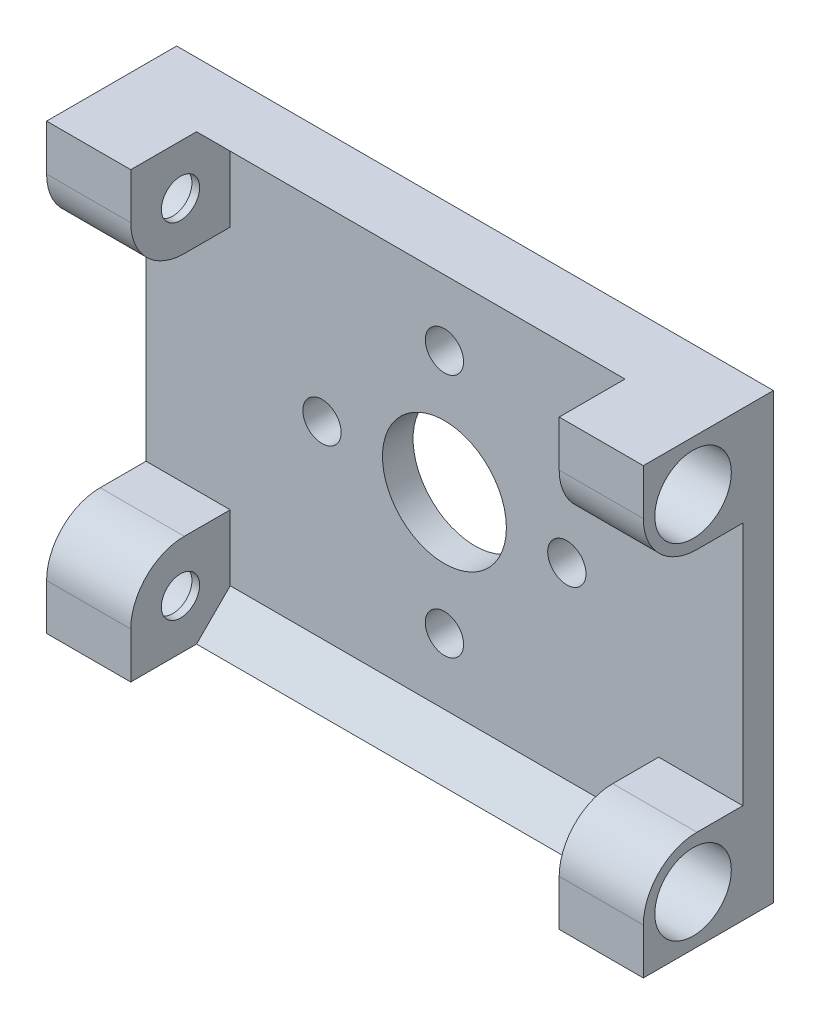
ISO-10303-21;
HEADER;
FILE_DESCRIPTION(('STEP AP214'),'2;1');
FILE_NAME('part.step','',(''),(''),'','','');
FILE_SCHEMA(('AUTOMOTIVE_DESIGN { 1 0 10303 214 1 1 1 1 }'));
ENDSEC;
DATA;
#1=APPLICATION_CONTEXT('core data for automotive mechanical design processes');
#2=APPLICATION_PROTOCOL_DEFINITION('international standard','automotive_design',2000,#1);
#3=PRODUCT_CONTEXT('',#1,'mechanical');
#4=PRODUCT('Part','Part','',(#3));
#5=PRODUCT_RELATED_PRODUCT_CATEGORY('part','',(#4));
#6=PRODUCT_DEFINITION_FORMATION('','',#4);
#7=PRODUCT_DEFINITION_CONTEXT('part definition',#1,'design');
#8=PRODUCT_DEFINITION('design','',#6,#7);
#9=PRODUCT_DEFINITION_SHAPE('','',#8);
#10=(LENGTH_UNIT() NAMED_UNIT(*) SI_UNIT(.MILLI.,.METRE.));
#11=(NAMED_UNIT(*) PLANE_ANGLE_UNIT() SI_UNIT($,.RADIAN.));
#12=(NAMED_UNIT(*) SI_UNIT($,.STERADIAN.) SOLID_ANGLE_UNIT());
#13=UNCERTAINTY_MEASURE_WITH_UNIT(LENGTH_MEASURE(1.E-05),#10,'distance_accuracy_value','');
#14=(GEOMETRIC_REPRESENTATION_CONTEXT(3) GLOBAL_UNCERTAINTY_ASSIGNED_CONTEXT((#13)) GLOBAL_UNIT_ASSIGNED_CONTEXT((#10,
#11,#12)) REPRESENTATION_CONTEXT('',''));
#15=CARTESIAN_POINT('',(0.,0.,0.));
#16=DIRECTION('',(0.,0.,1.));
#17=DIRECTION('',(1.,0.,0.));
#18=AXIS2_PLACEMENT_3D('',#15,#16,#17);
#19=CARTESIAN_POINT('',(-3.29953272048376,0.249999999999896,5.2500000000001));
#20=DIRECTION('',(-1.,0.,0.));
#21=DIRECTION('',(0.,0.,1.));
#22=AXIS2_PLACEMENT_3D('',#19,#20,#21);
#23=CYLINDRICAL_SURFACE('',#22,1.25);
#24=CARTESIAN_POINT('',(-14.0000000000002,0.249999999999896,5.2500000000001));
#25=DIRECTION('',(-1.,0.,0.));
#26=DIRECTION('',(0.,0.,1.));
#27=AXIS2_PLACEMENT_3D('',#24,#25,#26);
#28=CIRCLE('',#27,1.25);
#29=CARTESIAN_POINT('',(-14.0000000000002,0.249999999999896,6.5000000000001));
#30=VERTEX_POINT('',#29);
#31=EDGE_CURVE('E395',#30,#30,#28,.F.);
#32=ORIENTED_EDGE('',*,*,#31,.T.);
#33=EDGE_LOOP('',(#32));
#34=FACE_BOUND('',#33,.T.);
#35=CARTESIAN_POINT('',(-14.5,0.249999999999896,5.2500000000001));
#36=DIRECTION('',(-1.,0.,0.));
#37=DIRECTION('',(0.,0.,1.));
#38=AXIS2_PLACEMENT_3D('',#35,#36,#37);
#39=CIRCLE('',#38,1.25);
#40=CARTESIAN_POINT('',(-14.5,0.249999999999896,6.5000000000001));
#41=VERTEX_POINT('',#40);
#42=EDGE_CURVE('E111',#41,#41,#39,.F.);
#43=ORIENTED_EDGE('',*,*,#42,.F.);
#44=EDGE_LOOP('',(#43));
#45=FACE_BOUND('',#44,.T.);
#46=ADVANCED_FACE('F110',(#34,#45),#23,.F.);
#47=CARTESIAN_POINT('',(0.,0.,2.));
#48=DIRECTION('',(0.,0.,1.));
#49=DIRECTION('',(1.,0.,0.));
#50=AXIS2_PLACEMENT_3D('',#47,#48,#49);
#51=PLANE('',#50);
#52=DIRECTION('',(0.,-1.,0.));
#53=VECTOR('',#52,1.);
#54=CARTESIAN_POINT('',(13.9999999999998,0.,2.));
#55=LINE('',#54,#53);
#56=CARTESIAN_POINT('',(13.9999999999998,1.2999999999999,2.00000000000011));
#57=VERTEX_POINT('',#56);
#58=CARTESIAN_POINT('',(13.9999999999998,-3.0000000000001,2.));
#59=VERTEX_POINT('',#58);
#60=EDGE_CURVE('E257',#57,#59,#55,.T.);
#61=ORIENTED_EDGE('',*,*,#60,.F.);
#62=DIRECTION('',(1.,0.,0.));
#63=VECTOR('',#62,1.);
#64=CARTESIAN_POINT('',(-18.9627386254336,1.2999999999999,2.00000000000011));
#65=LINE('',#64,#63);
#66=CARTESIAN_POINT('',(-14.0000000000002,1.2999999999999,2.00000000000011));
#67=VERTEX_POINT('',#66);
#68=EDGE_CURVE('E264',#67,#57,#65,.T.);
#69=ORIENTED_EDGE('',*,*,#68,.F.);
#70=DIRECTION('',(0.,1.,0.));
#71=VECTOR('',#70,1.);
#72=CARTESIAN_POINT('',(-14.0000000000002,-3.0000000000001,2.));
#73=LINE('',#72,#71);
#74=CARTESIAN_POINT('',(-14.0000000000002,-3.0000000000001,2.));
#75=VERTEX_POINT('',#74);
#76=EDGE_CURVE('E121',#75,#67,#73,.T.);
#77=ORIENTED_EDGE('',*,*,#76,.F.);
#78=DIRECTION('',(-1.,0.,0.));
#79=VECTOR('',#78,1.);
#80=CARTESIAN_POINT('',(-3.29953272048376,-3.0000000000001,2.));
#81=LINE('',#80,#79);
#82=CARTESIAN_POINT('',(-19.5,-3.0000000000001,2.));
#83=VERTEX_POINT('',#82);
#84=EDGE_CURVE('E415',#75,#83,#81,.T.);
#85=ORIENTED_EDGE('',*,*,#84,.T.);
#86=DIRECTION('',(0.,-1.,0.));
#87=VECTOR('',#86,1.);
#88=CARTESIAN_POINT('',(-19.5,-22.8563709291264,2.));
#89=LINE('',#88,#87);
#90=CARTESIAN_POINT('',(-19.5,-18.9999999999999,2.));
#91=VERTEX_POINT('',#90);
#92=EDGE_CURVE('E116',#83,#91,#89,.T.);
#93=ORIENTED_EDGE('',*,*,#92,.T.);
#94=DIRECTION('',(-1.,0.,0.));
#95=VECTOR('',#94,1.);
#96=CARTESIAN_POINT('',(-3.29953272048376,-18.9999999999999,2.));
#97=LINE('',#96,#95);
#98=CARTESIAN_POINT('',(-14.0000000000002,-18.9999999999999,2.));
#99=VERTEX_POINT('',#98);
#100=EDGE_CURVE('E428',#99,#91,#97,.T.);
#101=ORIENTED_EDGE('',*,*,#100,.F.);
#102=DIRECTION('',(0.,1.,0.));
#103=VECTOR('',#102,1.);
#104=CARTESIAN_POINT('',(-14.0000000000002,-18.9999999999999,2.));
#105=LINE('',#104,#103);
#106=CARTESIAN_POINT('',(-14.0000000000002,-23.3000000000001,2.00000000000011));
#107=VERTEX_POINT('',#106);
#108=EDGE_CURVE('E135',#107,#99,#105,.T.);
#109=ORIENTED_EDGE('',*,*,#108,.F.);
#110=DIRECTION('',(1.,0.,0.));
#111=VECTOR('',#110,1.);
#112=CARTESIAN_POINT('',(-18.9627386254336,-23.3000000000001,2.00000000000011));
#113=LINE('',#112,#111);
#114=CARTESIAN_POINT('',(13.9999999999998,-23.3000000000001,2.00000000000011));
#115=VERTEX_POINT('',#114);
#116=EDGE_CURVE('E284',#107,#115,#113,.T.);
#117=ORIENTED_EDGE('',*,*,#116,.T.);
#118=CARTESIAN_POINT('',(13.9999999999998,-18.9999999999999,2.));
#119=VERTEX_POINT('',#118);
#120=EDGE_CURVE('E270',#119,#115,#55,.T.);
#121=ORIENTED_EDGE('',*,*,#120,.F.);
#122=DIRECTION('',(1.,0.,0.));
#123=VECTOR('',#122,1.);
#124=CARTESIAN_POINT('',(-16.2200264725232,-18.9999999999999,2.));
#125=LINE('',#124,#123);
#126=CARTESIAN_POINT('',(19.5,-18.9999999999999,2.));
#127=VERTEX_POINT('',#126);
#128=EDGE_CURVE('E348',#119,#127,#125,.T.);
#129=ORIENTED_EDGE('',*,*,#128,.T.);
#130=DIRECTION('',(0.,1.,0.));
#131=VECTOR('',#130,1.);
#132=CARTESIAN_POINT('',(19.5,-22.8563709291264,2.));
#133=LINE('',#132,#131);
#134=CARTESIAN_POINT('',(19.5,-3.0000000000001,2.));
#135=VERTEX_POINT('',#134);
#136=EDGE_CURVE('E12',#127,#135,#133,.T.);
#137=ORIENTED_EDGE('',*,*,#136,.T.);
#138=DIRECTION('',(1.,0.,0.));
#139=VECTOR('',#138,1.);
#140=CARTESIAN_POINT('',(-16.2200264725232,-3.0000000000001,2.));
#141=LINE('',#140,#139);
#142=EDGE_CURVE('E261',#59,#135,#141,.T.);
#143=ORIENTED_EDGE('',*,*,#142,.F.);
#144=EDGE_LOOP('',(#61,#69,#77,#85,#93,#101,#109,#117,#121,#129,#137,#143));
#145=FACE_BOUND('',#144,.T.);
#146=CARTESIAN_POINT('',(0.,-11.,2.));
#147=DIRECTION('',(0.,0.,1.));
#148=DIRECTION('',(1.,0.,0.));
#149=AXIS2_PLACEMENT_3D('',#146,#147,#148);
#150=CIRCLE('',#149,4.05);
#151=CARTESIAN_POINT('',(4.05,-11.,2.));
#152=VERTEX_POINT('',#151);
#153=EDGE_CURVE('E418',#152,#152,#150,.T.);
#154=ORIENTED_EDGE('',*,*,#153,.F.);
#155=EDGE_LOOP('',(#154));
#156=FACE_BOUND('',#155,.T.);
#157=CARTESIAN_POINT('',(0.,-3.,2.));
#158=DIRECTION('',(0.,0.,1.));
#159=DIRECTION('',(1.,0.,0.));
#160=AXIS2_PLACEMENT_3D('',#157,#158,#159);
#161=CIRCLE('',#160,1.25);
#162=CARTESIAN_POINT('',(1.25,-3.,2.));
#163=VERTEX_POINT('',#162);
#164=EDGE_CURVE('E464',#163,#163,#161,.T.);
#165=ORIENTED_EDGE('',*,*,#164,.F.);
#166=EDGE_LOOP('',(#165));
#167=FACE_BOUND('',#166,.T.);
#168=CARTESIAN_POINT('',(0.,-19.,2.));
#169=DIRECTION('',(0.,0.,1.));
#170=DIRECTION('',(1.,0.,0.));
#171=AXIS2_PLACEMENT_3D('',#168,#169,#170);
#172=CIRCLE('',#171,1.25);
#173=CARTESIAN_POINT('',(1.25,-19.,2.));
#174=VERTEX_POINT('',#173);
#175=EDGE_CURVE('E477',#174,#174,#172,.T.);
#176=ORIENTED_EDGE('',*,*,#175,.F.);
#177=EDGE_LOOP('',(#176));
#178=FACE_BOUND('',#177,.T.);
#179=CARTESIAN_POINT('',(-8.,-11.,2.));
#180=DIRECTION('',(0.,0.,1.));
#181=DIRECTION('',(1.,0.,0.));
#182=AXIS2_PLACEMENT_3D('',#179,#180,#181);
#183=CIRCLE('',#182,1.25);
#184=CARTESIAN_POINT('',(-6.75,-11.,2.));
#185=VERTEX_POINT('',#184);
#186=EDGE_CURVE('E468',#185,#185,#183,.T.);
#187=ORIENTED_EDGE('',*,*,#186,.F.);
#188=EDGE_LOOP('',(#187));
#189=FACE_BOUND('',#188,.T.);
#190=CARTESIAN_POINT('',(8.,-11.,2.));
#191=DIRECTION('',(0.,0.,1.));
#192=DIRECTION('',(1.,0.,0.));
#193=AXIS2_PLACEMENT_3D('',#190,#191,#192);
#194=CIRCLE('',#193,1.25);
#195=CARTESIAN_POINT('',(9.25,-11.,2.));
#196=VERTEX_POINT('',#195);
#197=EDGE_CURVE('E460',#196,#196,#194,.T.);
#198=ORIENTED_EDGE('',*,*,#197,.F.);
#199=EDGE_LOOP('',(#198));
#200=FACE_BOUND('',#199,.T.);
#201=ADVANCED_FACE('F259',(#145,#156,#167,#178,#189,#200),#51,.T.);
#202=CARTESIAN_POINT('',(0.,0.,0.));
#203=DIRECTION('',(0.,0.,1.));
#204=DIRECTION('',(1.,0.,0.));
#205=AXIS2_PLACEMENT_3D('',#202,#203,#204);
#206=PLANE('',#205);
#207=DIRECTION('',(-1.,0.,0.));
#208=VECTOR('',#207,1.);
#209=CARTESIAN_POINT('',(-3.29953272048376,3.4999999999999,0.));
#210=LINE('',#209,#208);
#211=CARTESIAN_POINT('',(19.5,3.4999999999999,0.));
#212=VERTEX_POINT('',#211);
#213=CARTESIAN_POINT('',(-19.5,3.4999999999999,0.));
#214=VERTEX_POINT('',#213);
#215=EDGE_CURVE('E406',#212,#214,#210,.T.);
#216=ORIENTED_EDGE('',*,*,#215,.F.);
#217=DIRECTION('',(0.,1.,0.));
#218=VECTOR('',#217,1.);
#219=CARTESIAN_POINT('',(19.5,-22.8563709291264,0.));
#220=LINE('',#219,#218);
#221=CARTESIAN_POINT('',(19.5,-25.4999999999999,0.));
#222=VERTEX_POINT('',#221);
#223=EDGE_CURVE('E485',#222,#212,#220,.T.);
#224=ORIENTED_EDGE('',*,*,#223,.F.);
#225=DIRECTION('',(-1.,0.,0.));
#226=VECTOR('',#225,1.);
#227=CARTESIAN_POINT('',(-3.29953272048376,-25.4999999999999,0.));
#228=LINE('',#227,#226);
#229=CARTESIAN_POINT('',(-19.5,-25.4999999999999,0.));
#230=VERTEX_POINT('',#229);
#231=EDGE_CURVE('E429',#222,#230,#228,.T.);
#232=ORIENTED_EDGE('',*,*,#231,.T.);
#233=DIRECTION('',(0.,-1.,0.));
#234=VECTOR('',#233,1.);
#235=CARTESIAN_POINT('',(-19.5,-22.8563709291264,0.));
#236=LINE('',#235,#234);
#237=EDGE_CURVE('E476',#214,#230,#236,.T.);
#238=ORIENTED_EDGE('',*,*,#237,.F.);
#239=EDGE_LOOP('',(#216,#224,#232,#238));
#240=FACE_BOUND('',#239,.T.);
#241=CARTESIAN_POINT('',(8.,-11.,0.));
#242=DIRECTION('',(0.,0.,1.));
#243=DIRECTION('',(1.,0.,0.));
#244=AXIS2_PLACEMENT_3D('',#241,#242,#243);
#245=CIRCLE('',#244,1.25);
#246=CARTESIAN_POINT('',(9.25,-11.,0.));
#247=VERTEX_POINT('',#246);
#248=EDGE_CURVE('E462',#247,#247,#245,.T.);
#249=ORIENTED_EDGE('',*,*,#248,.T.);
#250=EDGE_LOOP('',(#249));
#251=FACE_BOUND('',#250,.T.);
#252=CARTESIAN_POINT('',(0.,-3.,0.));
#253=DIRECTION('',(0.,0.,1.));
#254=DIRECTION('',(1.,0.,0.));
#255=AXIS2_PLACEMENT_3D('',#252,#253,#254);
#256=CIRCLE('',#255,1.25);
#257=CARTESIAN_POINT('',(1.25,-3.,0.));
#258=VERTEX_POINT('',#257);
#259=EDGE_CURVE('E458',#258,#258,#256,.T.);
#260=ORIENTED_EDGE('',*,*,#259,.T.);
#261=EDGE_LOOP('',(#260));
#262=FACE_BOUND('',#261,.T.);
#263=CARTESIAN_POINT('',(-8.,-11.,0.));
#264=DIRECTION('',(0.,0.,1.));
#265=DIRECTION('',(1.,0.,0.));
#266=AXIS2_PLACEMENT_3D('',#263,#264,#265);
#267=CIRCLE('',#266,1.25);
#268=CARTESIAN_POINT('',(-6.75,-11.,0.));
#269=VERTEX_POINT('',#268);
#270=EDGE_CURVE('E470',#269,#269,#267,.T.);
#271=ORIENTED_EDGE('',*,*,#270,.T.);
#272=EDGE_LOOP('',(#271));
#273=FACE_BOUND('',#272,.T.);
#274=CARTESIAN_POINT('',(0.,-19.,0.));
#275=DIRECTION('',(0.,0.,1.));
#276=DIRECTION('',(1.,0.,0.));
#277=AXIS2_PLACEMENT_3D('',#274,#275,#276);
#278=CIRCLE('',#277,1.25);
#279=CARTESIAN_POINT('',(1.25,-19.,0.));
#280=VERTEX_POINT('',#279);
#281=EDGE_CURVE('E472',#280,#280,#278,.T.);
#282=ORIENTED_EDGE('',*,*,#281,.T.);
#283=EDGE_LOOP('',(#282));
#284=FACE_BOUND('',#283,.T.);
#285=CARTESIAN_POINT('',(0.,-11.,0.));
#286=DIRECTION('',(0.,0.,1.));
#287=DIRECTION('',(1.,0.,0.));
#288=AXIS2_PLACEMENT_3D('',#285,#286,#287);
#289=CIRCLE('',#288,4.05);
#290=CARTESIAN_POINT('',(4.05,-11.,0.));
#291=VERTEX_POINT('',#290);
#292=EDGE_CURVE('E457',#291,#291,#289,.T.);
#293=ORIENTED_EDGE('',*,*,#292,.T.);
#294=EDGE_LOOP('',(#293));
#295=FACE_BOUND('',#294,.T.);
#296=ADVANCED_FACE('F502',(#240,#251,#262,#273,#284,#295),#206,.F.);
#297=CARTESIAN_POINT('',(-19.5,-22.8563709291264,2.));
#298=DIRECTION('',(1.,0.,0.));
#299=DIRECTION('',(0.,0.,-1.));
#300=AXIS2_PLACEMENT_3D('',#297,#298,#299);
#301=PLANE('',#300);
#302=CARTESIAN_POINT('',(-19.5,0.249999999999896,5.2500000000001));
#303=DIRECTION('',(-1.,0.,0.));
#304=DIRECTION('',(0.,0.,1.));
#305=AXIS2_PLACEMENT_3D('',#302,#303,#304);
#306=CIRCLE('',#305,2.5);
#307=CARTESIAN_POINT('',(-19.5,0.249999999999896,7.7500000000001));
#308=VERTEX_POINT('',#307);
#309=EDGE_CURVE('E373',#308,#308,#306,.T.);
#310=ORIENTED_EDGE('',*,*,#309,.F.);
#311=EDGE_LOOP('',(#310));
#312=FACE_BOUND('',#311,.T.);
#313=CARTESIAN_POINT('',(-19.5,-22.2500000000001,5.2500000000001));
#314=DIRECTION('',(-1.,0.,0.));
#315=DIRECTION('',(0.,0.,-1.));
#316=AXIS2_PLACEMENT_3D('',#313,#314,#315);
#317=CIRCLE('',#316,2.5);
#318=CARTESIAN_POINT('',(-19.5,-22.2500000000001,2.7500000000001));
#319=VERTEX_POINT('',#318);
#320=EDGE_CURVE('E376',#319,#319,#317,.T.);
#321=ORIENTED_EDGE('',*,*,#320,.F.);
#322=EDGE_LOOP('',(#321));
#323=FACE_BOUND('',#322,.T.);
#324=ORIENTED_EDGE('',*,*,#92,.F.);
#325=DIRECTION('',(0.,0.,1.));
#326=VECTOR('',#325,1.);
#327=CARTESIAN_POINT('',(-19.5,-3.0000000000001,5.0000000000001));
#328=LINE('',#327,#326);
#329=CARTESIAN_POINT('',(-19.5,-3.0000000000001,5.0000000000001));
#330=VERTEX_POINT('',#329);
#331=EDGE_CURVE('E394',#83,#330,#328,.T.);
#332=ORIENTED_EDGE('',*,*,#331,.T.);
#333=CARTESIAN_POINT('',(-19.5,0.499999999999896,5.0000000000001));
#334=DIRECTION('',(-1.,0.,0.));
#335=DIRECTION('',(0.,0.,1.));
#336=AXIS2_PLACEMENT_3D('',#333,#334,#335);
#337=CIRCLE('',#336,3.5);
#338=CARTESIAN_POINT('',(-19.5,0.499999999999896,8.5000000000001));
#339=VERTEX_POINT('',#338);
#340=EDGE_CURVE('E397',#330,#339,#337,.T.);
#341=ORIENTED_EDGE('',*,*,#340,.T.);
#342=DIRECTION('',(0.,1.,0.));
#343=VECTOR('',#342,1.);
#344=CARTESIAN_POINT('',(-19.5,3.4999999999999,8.5000000000001));
#345=LINE('',#344,#343);
#346=CARTESIAN_POINT('',(-19.5,3.4999999999999,8.5000000000001));
#347=VERTEX_POINT('',#346);
#348=EDGE_CURVE('E396',#339,#347,#345,.T.);
#349=ORIENTED_EDGE('',*,*,#348,.T.);
#350=DIRECTION('',(0.,0.,-1.));
#351=VECTOR('',#350,1.);
#352=CARTESIAN_POINT('',(-19.5,3.4999999999999,4.20000000000011));
#353=LINE('',#352,#351);
#354=EDGE_CURVE('E401',#347,#214,#353,.T.);
#355=ORIENTED_EDGE('',*,*,#354,.T.);
#356=ORIENTED_EDGE('',*,*,#237,.T.);
#357=DIRECTION('',(0.,0.,1.));
#358=VECTOR('',#357,1.);
#359=CARTESIAN_POINT('',(-19.5,-25.4999999999999,4.20000000000011));
#360=LINE('',#359,#358);
#361=CARTESIAN_POINT('',(-19.5,-25.4999999999999,8.5000000000001));
#362=VERTEX_POINT('',#361);
#363=EDGE_CURVE('E438',#230,#362,#360,.T.);
#364=ORIENTED_EDGE('',*,*,#363,.T.);
#365=DIRECTION('',(0.,1.,0.));
#366=VECTOR('',#365,1.);
#367=CARTESIAN_POINT('',(-19.5,-25.4999999999999,8.5000000000001));
#368=LINE('',#367,#366);
#369=CARTESIAN_POINT('',(-19.5,-22.4999999999999,8.5000000000001));
#370=VERTEX_POINT('',#369);
#371=EDGE_CURVE('E424',#362,#370,#368,.T.);
#372=ORIENTED_EDGE('',*,*,#371,.T.);
#373=CARTESIAN_POINT('',(-19.5,-22.4999999999999,5.0000000000001));
#374=DIRECTION('',(-1.,0.,0.));
#375=DIRECTION('',(0.,0.,-1.));
#376=AXIS2_PLACEMENT_3D('',#373,#374,#375);
#377=CIRCLE('',#376,3.5);
#378=CARTESIAN_POINT('',(-19.5,-18.9999999999999,5.0000000000001));
#379=VERTEX_POINT('',#378);
#380=EDGE_CURVE('E400',#370,#379,#377,.T.);
#381=ORIENTED_EDGE('',*,*,#380,.T.);
#382=DIRECTION('',(0.,0.,-1.));
#383=VECTOR('',#382,1.);
#384=CARTESIAN_POINT('',(-19.5,-18.9999999999999,5.0000000000001));
#385=LINE('',#384,#383);
#386=EDGE_CURVE('E441',#379,#91,#385,.T.);
#387=ORIENTED_EDGE('',*,*,#386,.T.);
#388=EDGE_LOOP('',(#324,#332,#341,#349,#355,#356,#364,#372,#381,#387));
#389=FACE_BOUND('',#388,.T.);
#390=ADVANCED_FACE('F107',(#312,#323,#389),#301,.F.);
#391=CARTESIAN_POINT('',(19.5,-22.8563709291264,2.));
#392=DIRECTION('',(-1.,0.,0.));
#393=DIRECTION('',(0.,0.,1.));
#394=AXIS2_PLACEMENT_3D('',#391,#392,#393);
#395=PLANE('',#394);
#396=ORIENTED_EDGE('',*,*,#223,.T.);
#397=DIRECTION('',(0.,0.,1.));
#398=VECTOR('',#397,1.);
#399=CARTESIAN_POINT('',(19.5,3.4999999999999,0.));
#400=LINE('',#399,#398);
#401=CARTESIAN_POINT('',(19.5,3.4999999999999,8.5000000000001));
#402=VERTEX_POINT('',#401);
#403=EDGE_CURVE('E317',#212,#402,#400,.T.);
#404=ORIENTED_EDGE('',*,*,#403,.T.);
#405=DIRECTION('',(0.,-1.,0.));
#406=VECTOR('',#405,1.);
#407=CARTESIAN_POINT('',(19.5,3.4999999999999,8.5000000000001));
#408=LINE('',#407,#406);
#409=CARTESIAN_POINT('',(19.5,0.499999999999896,8.5000000000001));
#410=VERTEX_POINT('',#409);
#411=EDGE_CURVE('E312',#402,#410,#408,.T.);
#412=ORIENTED_EDGE('',*,*,#411,.T.);
#413=CARTESIAN_POINT('',(19.5,0.499999999999896,5.0000000000001));
#414=DIRECTION('',(1.,0.,0.));
#415=DIRECTION('',(0.,0.,-1.));
#416=AXIS2_PLACEMENT_3D('',#413,#414,#415);
#417=CIRCLE('',#416,3.5);
#418=CARTESIAN_POINT('',(19.5,-3.0000000000001,5.0000000000001));
#419=VERTEX_POINT('',#418);
#420=EDGE_CURVE('E309',#410,#419,#417,.T.);
#421=ORIENTED_EDGE('',*,*,#420,.T.);
#422=DIRECTION('',(0.,0.,-1.));
#423=VECTOR('',#422,1.);
#424=CARTESIAN_POINT('',(19.5,-3.0000000000001,5.0000000000001));
#425=LINE('',#424,#423);
#426=EDGE_CURVE('E310',#419,#135,#425,.T.);
#427=ORIENTED_EDGE('',*,*,#426,.T.);
#428=ORIENTED_EDGE('',*,*,#136,.F.);
#429=DIRECTION('',(0.,0.,1.));
#430=VECTOR('',#429,1.);
#431=CARTESIAN_POINT('',(19.5,-18.9999999999999,2.));
#432=LINE('',#431,#430);
#433=CARTESIAN_POINT('',(19.5,-18.9999999999999,5.0000000000001));
#434=VERTEX_POINT('',#433);
#435=EDGE_CURVE('E302',#127,#434,#432,.T.);
#436=ORIENTED_EDGE('',*,*,#435,.T.);
#437=CARTESIAN_POINT('',(19.5,-22.4999999999999,5.0000000000001));
#438=DIRECTION('',(1.,0.,0.));
#439=DIRECTION('',(0.,0.,-1.));
#440=AXIS2_PLACEMENT_3D('',#437,#438,#439);
#441=CIRCLE('',#440,3.5);
#442=CARTESIAN_POINT('',(19.5,-22.4999999999999,8.5000000000001));
#443=VERTEX_POINT('',#442);
#444=EDGE_CURVE('E301',#434,#443,#441,.T.);
#445=ORIENTED_EDGE('',*,*,#444,.T.);
#446=DIRECTION('',(0.,-1.,0.));
#447=VECTOR('',#446,1.);
#448=CARTESIAN_POINT('',(19.5,-22.4999999999999,8.5000000000001));
#449=LINE('',#448,#447);
#450=CARTESIAN_POINT('',(19.5,-25.4999999999999,8.5000000000001));
#451=VERTEX_POINT('',#450);
#452=EDGE_CURVE('E300',#443,#451,#449,.T.);
#453=ORIENTED_EDGE('',*,*,#452,.T.);
#454=DIRECTION('',(0.,0.,-1.));
#455=VECTOR('',#454,1.);
#456=CARTESIAN_POINT('',(19.5,-25.4999999999999,8.5000000000001));
#457=LINE('',#456,#455);
#458=EDGE_CURVE('E316',#451,#222,#457,.T.);
#459=ORIENTED_EDGE('',*,*,#458,.T.);
#460=EDGE_LOOP('',(#396,#404,#412,#421,#427,#428,#436,#445,#453,#459));
#461=FACE_BOUND('',#460,.T.);
#462=CARTESIAN_POINT('',(19.5,0.249999999999896,5.2500000000001));
#463=DIRECTION('',(1.,0.,0.));
#464=DIRECTION('',(0.,0.,-1.));
#465=AXIS2_PLACEMENT_3D('',#462,#463,#464);
#466=CIRCLE('',#465,2.5);
#467=CARTESIAN_POINT('',(19.5,0.249999999999896,2.7500000000001));
#468=VERTEX_POINT('',#467);
#469=EDGE_CURVE('E325',#468,#468,#466,.T.);
#470=ORIENTED_EDGE('',*,*,#469,.F.);
#471=EDGE_LOOP('',(#470));
#472=FACE_BOUND('',#471,.T.);
#473=CARTESIAN_POINT('',(19.5,-22.2500000000001,5.25000000000008));
#474=DIRECTION('',(1.,0.,0.));
#475=DIRECTION('',(0.,0.,-1.));
#476=AXIS2_PLACEMENT_3D('',#473,#474,#475);
#477=CIRCLE('',#476,2.5);
#478=CARTESIAN_POINT('',(19.5,-22.2500000000001,2.75000000000008));
#479=VERTEX_POINT('',#478);
#480=EDGE_CURVE('E322',#479,#479,#477,.T.);
#481=ORIENTED_EDGE('',*,*,#480,.F.);
#482=EDGE_LOOP('',(#481));
#483=FACE_BOUND('',#482,.T.);
#484=ADVANCED_FACE('F570',(#461,#472,#483),#395,.F.);
#485=CARTESIAN_POINT('',(0.,-19.,2.));
#486=DIRECTION('',(0.,0.,-1.));
#487=DIRECTION('',(-1.,0.,0.));
#488=AXIS2_PLACEMENT_3D('',#485,#486,#487);
#489=CYLINDRICAL_SURFACE('',#488,1.25);
#490=ORIENTED_EDGE('',*,*,#281,.F.);
#491=EDGE_LOOP('',(#490));
#492=FACE_BOUND('',#491,.T.);
#493=ORIENTED_EDGE('',*,*,#175,.T.);
#494=EDGE_LOOP('',(#493));
#495=FACE_BOUND('',#494,.T.);
#496=ADVANCED_FACE('F562',(#492,#495),#489,.F.);
#497=CARTESIAN_POINT('',(-8.,-11.,2.));
#498=DIRECTION('',(0.,0.,-1.));
#499=DIRECTION('',(-1.,0.,0.));
#500=AXIS2_PLACEMENT_3D('',#497,#498,#499);
#501=CYLINDRICAL_SURFACE('',#500,1.25);
#502=ORIENTED_EDGE('',*,*,#270,.F.);
#503=EDGE_LOOP('',(#502));
#504=FACE_BOUND('',#503,.T.);
#505=ORIENTED_EDGE('',*,*,#186,.T.);
#506=EDGE_LOOP('',(#505));
#507=FACE_BOUND('',#506,.T.);
#508=ADVANCED_FACE('F557',(#504,#507),#501,.F.);
#509=CARTESIAN_POINT('',(0.,-3.,2.));
#510=DIRECTION('',(0.,0.,-1.));
#511=DIRECTION('',(-1.,0.,0.));
#512=AXIS2_PLACEMENT_3D('',#509,#510,#511);
#513=CYLINDRICAL_SURFACE('',#512,1.25);
#514=ORIENTED_EDGE('',*,*,#259,.F.);
#515=EDGE_LOOP('',(#514));
#516=FACE_BOUND('',#515,.T.);
#517=ORIENTED_EDGE('',*,*,#164,.T.);
#518=EDGE_LOOP('',(#517));
#519=FACE_BOUND('',#518,.T.);
#520=ADVANCED_FACE('F558',(#516,#519),#513,.F.);
#521=CARTESIAN_POINT('',(8.,-11.,2.));
#522=DIRECTION('',(0.,0.,-1.));
#523=DIRECTION('',(-1.,0.,0.));
#524=AXIS2_PLACEMENT_3D('',#521,#522,#523);
#525=CYLINDRICAL_SURFACE('',#524,1.25);
#526=ORIENTED_EDGE('',*,*,#248,.F.);
#527=EDGE_LOOP('',(#526));
#528=FACE_BOUND('',#527,.T.);
#529=ORIENTED_EDGE('',*,*,#197,.T.);
#530=EDGE_LOOP('',(#529));
#531=FACE_BOUND('',#530,.T.);
#532=ADVANCED_FACE('F552',(#528,#531),#525,.F.);
#533=CARTESIAN_POINT('',(0.,-11.,-3.));
#534=DIRECTION('',(0.,0.,1.));
#535=DIRECTION('',(1.,0.,0.));
#536=AXIS2_PLACEMENT_3D('',#533,#534,#535);
#537=CYLINDRICAL_SURFACE('',#536,4.05);
#538=ORIENTED_EDGE('',*,*,#153,.T.);
#539=EDGE_LOOP('',(#538));
#540=FACE_BOUND('',#539,.T.);
#541=ORIENTED_EDGE('',*,*,#292,.F.);
#542=EDGE_LOOP('',(#541));
#543=FACE_BOUND('',#542,.T.);
#544=ADVANCED_FACE('F523',(#540,#543),#537,.F.);
#545=CARTESIAN_POINT('',(-3.29953272048376,-3.0000000000001,5.0000000000001));
#546=DIRECTION('',(0.,-1.,0.));
#547=DIRECTION('',(0.,0.,-1.));
#548=AXIS2_PLACEMENT_3D('',#545,#546,#547);
#549=PLANE('',#548);
#550=DIRECTION('',(0.,0.,-1.));
#551=VECTOR('',#550,1.);
#552=CARTESIAN_POINT('',(-14.0000000000002,-3.0000000000001,5.0000000000001));
#553=LINE('',#552,#551);
#554=CARTESIAN_POINT('',(-14.0000000000002,-3.0000000000001,5.0000000000001));
#555=VERTEX_POINT('',#554);
#556=EDGE_CURVE('E384',#555,#75,#553,.T.);
#557=ORIENTED_EDGE('',*,*,#556,.F.);
#558=DIRECTION('',(-1.,0.,0.));
#559=VECTOR('',#558,1.);
#560=CARTESIAN_POINT('',(-3.29953272048376,-3.0000000000001,5.0000000000001));
#561=LINE('',#560,#559);
#562=EDGE_CURVE('E409',#555,#330,#561,.T.);
#563=ORIENTED_EDGE('',*,*,#562,.T.);
#564=ORIENTED_EDGE('',*,*,#331,.F.);
#565=ORIENTED_EDGE('',*,*,#84,.F.);
#566=EDGE_LOOP('',(#557,#563,#564,#565));
#567=FACE_BOUND('',#566,.T.);
#568=ADVANCED_FACE('F522',(#567),#549,.T.);
#569=CARTESIAN_POINT('',(-3.29953272048376,0.499999999999896,5.0000000000001));
#570=DIRECTION('',(-1.,0.,0.));
#571=DIRECTION('',(0.,0.,1.));
#572=AXIS2_PLACEMENT_3D('',#569,#570,#571);
#573=CYLINDRICAL_SURFACE('',#572,3.5);
#574=CARTESIAN_POINT('',(-14.0000000000002,0.499999999999896,5.0000000000001));
#575=DIRECTION('',(-1.,0.,0.));
#576=DIRECTION('',(0.,0.,1.));
#577=AXIS2_PLACEMENT_3D('',#574,#575,#576);
#578=CIRCLE('',#577,3.5);
#579=CARTESIAN_POINT('',(-14.0000000000002,0.499999999999896,8.5000000000001));
#580=VERTEX_POINT('',#579);
#581=EDGE_CURVE('E386',#580,#555,#578,.F.);
#582=ORIENTED_EDGE('',*,*,#581,.F.);
#583=DIRECTION('',(-1.,0.,0.));
#584=VECTOR('',#583,1.);
#585=CARTESIAN_POINT('',(-3.29953272048376,0.499999999999896,8.5000000000001));
#586=LINE('',#585,#584);
#587=EDGE_CURVE('E407',#580,#339,#586,.T.);
#588=ORIENTED_EDGE('',*,*,#587,.T.);
#589=ORIENTED_EDGE('',*,*,#340,.F.);
#590=ORIENTED_EDGE('',*,*,#562,.F.);
#591=EDGE_LOOP('',(#582,#588,#589,#590));
#592=FACE_BOUND('',#591,.T.);
#593=ADVANCED_FACE('F520',(#592),#573,.T.);
#594=CARTESIAN_POINT('',(-3.29953272048376,3.4999999999999,8.5000000000001));
#595=DIRECTION('',(0.,0.,1.));
#596=DIRECTION('',(0.,-1.,0.));
#597=AXIS2_PLACEMENT_3D('',#594,#595,#596);
#598=PLANE('',#597);
#599=DIRECTION('',(0.,-1.,0.));
#600=VECTOR('',#599,1.);
#601=CARTESIAN_POINT('',(-14.0000000000002,3.4999999999999,8.5000000000001));
#602=LINE('',#601,#600);
#603=CARTESIAN_POINT('',(-14.0000000000002,3.4999999999999,8.5000000000001));
#604=VERTEX_POINT('',#603);
#605=EDGE_CURVE('E387',#604,#580,#602,.T.);
#606=ORIENTED_EDGE('',*,*,#605,.F.);
#607=DIRECTION('',(-1.,0.,0.));
#608=VECTOR('',#607,1.);
#609=CARTESIAN_POINT('',(-3.29953272048376,3.4999999999999,8.5000000000001));
#610=LINE('',#609,#608);
#611=EDGE_CURVE('E381',#604,#347,#610,.T.);
#612=ORIENTED_EDGE('',*,*,#611,.T.);
#613=ORIENTED_EDGE('',*,*,#348,.F.);
#614=ORIENTED_EDGE('',*,*,#587,.F.);
#615=EDGE_LOOP('',(#606,#612,#613,#614));
#616=FACE_BOUND('',#615,.T.);
#617=ADVANCED_FACE('F514',(#616),#598,.T.);
#618=CARTESIAN_POINT('',(-3.29953272048376,3.4999999999999,4.20000000000011));
#619=DIRECTION('',(0.,1.,0.));
#620=DIRECTION('',(0.,0.,1.));
#621=AXIS2_PLACEMENT_3D('',#618,#619,#620);
#622=PLANE('',#621);
#623=DIRECTION('',(0.,0.,1.));
#624=VECTOR('',#623,1.);
#625=CARTESIAN_POINT('',(-14.0000000000002,3.4999999999999,4.20000000000011));
#626=LINE('',#625,#624);
#627=CARTESIAN_POINT('',(-14.0000000000002,3.4999999999999,4.20000000000009));
#628=VERTEX_POINT('',#627);
#629=EDGE_CURVE('E389',#628,#604,#626,.T.);
#630=ORIENTED_EDGE('',*,*,#629,.F.);
#631=DIRECTION('',(1.,0.,0.));
#632=VECTOR('',#631,1.);
#633=CARTESIAN_POINT('',(-18.9627386254336,3.4999999999999,4.20000000000009));
#634=LINE('',#633,#632);
#635=CARTESIAN_POINT('',(13.9999999999998,3.4999999999999,4.20000000000009));
#636=VERTEX_POINT('',#635);
#637=EDGE_CURVE('E278',#628,#636,#634,.T.);
#638=ORIENTED_EDGE('',*,*,#637,.T.);
#639=DIRECTION('',(0.,0.,1.));
#640=VECTOR('',#639,1.);
#641=CARTESIAN_POINT('',(13.9999999999998,3.4999999999999,0.));
#642=LINE('',#641,#640);
#643=CARTESIAN_POINT('',(13.9999999999998,3.4999999999999,8.5000000000001));
#644=VERTEX_POINT('',#643);
#645=EDGE_CURVE('E273',#636,#644,#642,.T.);
#646=ORIENTED_EDGE('',*,*,#645,.T.);
#647=DIRECTION('',(1.,0.,0.));
#648=VECTOR('',#647,1.);
#649=CARTESIAN_POINT('',(-16.2200264725232,3.4999999999999,8.5000000000001));
#650=LINE('',#649,#648);
#651=EDGE_CURVE('E327',#644,#402,#650,.T.);
#652=ORIENTED_EDGE('',*,*,#651,.T.);
#653=ORIENTED_EDGE('',*,*,#403,.F.);
#654=ORIENTED_EDGE('',*,*,#215,.T.);
#655=ORIENTED_EDGE('',*,*,#354,.F.);
#656=ORIENTED_EDGE('',*,*,#611,.F.);
#657=EDGE_LOOP('',(#630,#638,#646,#652,#653,#654,#655,#656));
#658=FACE_BOUND('',#657,.T.);
#659=ADVANCED_FACE('F509',(#658),#622,.T.);
#660=CARTESIAN_POINT('',(-14.0000000000002,-11.0000000000001,48.5000000000001));
#661=DIRECTION('',(-1.,0.,0.));
#662=DIRECTION('',(0.,-1.,0.));
#663=AXIS2_PLACEMENT_3D('',#660,#661,#662);
#664=PLANE('',#663);
#665=ORIENTED_EDGE('',*,*,#76,.T.);
#666=DIRECTION('',(0.,0.70710678118655,0.707106781186545));
#667=VECTOR('',#666,1.);
#668=CARTESIAN_POINT('',(-14.0000000000002,3.4999999999999,4.20000000000009));
#669=LINE('',#668,#667);
#670=EDGE_CURVE('E285',#67,#628,#669,.T.);
#671=ORIENTED_EDGE('',*,*,#670,.T.);
#672=ORIENTED_EDGE('',*,*,#629,.T.);
#673=ORIENTED_EDGE('',*,*,#605,.T.);
#674=ORIENTED_EDGE('',*,*,#581,.T.);
#675=ORIENTED_EDGE('',*,*,#556,.T.);
#676=EDGE_LOOP('',(#665,#671,#672,#673,#674,#675));
#677=FACE_BOUND('',#676,.T.);
#678=ORIENTED_EDGE('',*,*,#31,.F.);
#679=EDGE_LOOP('',(#678));
#680=FACE_BOUND('',#679,.T.);
#681=ADVANCED_FACE('F507',(#677,#680),#664,.F.);
#682=CARTESIAN_POINT('',(-3.29953272048376,-18.9999999999999,5.0000000000001));
#683=DIRECTION('',(0.,1.,0.));
#684=DIRECTION('',(0.,0.,1.));
#685=AXIS2_PLACEMENT_3D('',#682,#683,#684);
#686=PLANE('',#685);
#687=DIRECTION('',(0.,0.,1.));
#688=VECTOR('',#687,1.);
#689=CARTESIAN_POINT('',(-14.0000000000002,-18.9999999999999,5.0000000000001));
#690=LINE('',#689,#688);
#691=CARTESIAN_POINT('',(-14.0000000000002,-18.9999999999999,5.0000000000001));
#692=VERTEX_POINT('',#691);
#693=EDGE_CURVE('E422',#99,#692,#690,.T.);
#694=ORIENTED_EDGE('',*,*,#693,.F.);
#695=ORIENTED_EDGE('',*,*,#100,.T.);
#696=ORIENTED_EDGE('',*,*,#386,.F.);
#697=DIRECTION('',(-1.,0.,0.));
#698=VECTOR('',#697,1.);
#699=CARTESIAN_POINT('',(-3.29953272048376,-18.9999999999999,5.0000000000001));
#700=LINE('',#699,#698);
#701=EDGE_CURVE('E421',#692,#379,#700,.T.);
#702=ORIENTED_EDGE('',*,*,#701,.F.);
#703=EDGE_LOOP('',(#694,#695,#696,#702));
#704=FACE_BOUND('',#703,.T.);
#705=ADVANCED_FACE('F535',(#704),#686,.T.);
#706=CARTESIAN_POINT('',(-3.29953272048376,-25.4999999999999,4.20000000000011));
#707=DIRECTION('',(0.,-1.,0.));
#708=DIRECTION('',(0.,0.,-1.));
#709=AXIS2_PLACEMENT_3D('',#706,#707,#708);
#710=PLANE('',#709);
#711=DIRECTION('',(0.,0.,-1.));
#712=VECTOR('',#711,1.);
#713=CARTESIAN_POINT('',(-14.0000000000002,-25.4999999999999,4.20000000000011));
#714=LINE('',#713,#712);
#715=CARTESIAN_POINT('',(-14.0000000000002,-25.4999999999999,8.5000000000001));
#716=VERTEX_POINT('',#715);
#717=CARTESIAN_POINT('',(-14.0000000000002,-25.4999999999999,4.19999999999989));
#718=VERTEX_POINT('',#717);
#719=EDGE_CURVE('E448',#716,#718,#714,.T.);
#720=ORIENTED_EDGE('',*,*,#719,.F.);
#721=DIRECTION('',(-1.,0.,0.));
#722=VECTOR('',#721,1.);
#723=CARTESIAN_POINT('',(-3.29953272048376,-25.4999999999999,8.5000000000001));
#724=LINE('',#723,#722);
#725=EDGE_CURVE('E435',#716,#362,#724,.T.);
#726=ORIENTED_EDGE('',*,*,#725,.T.);
#727=ORIENTED_EDGE('',*,*,#363,.F.);
#728=ORIENTED_EDGE('',*,*,#231,.F.);
#729=ORIENTED_EDGE('',*,*,#458,.F.);
#730=DIRECTION('',(1.,0.,0.));
#731=VECTOR('',#730,1.);
#732=CARTESIAN_POINT('',(-16.2200264725232,-25.4999999999999,8.5000000000001));
#733=LINE('',#732,#731);
#734=CARTESIAN_POINT('',(13.9999999999998,-25.4999999999999,8.5000000000001));
#735=VERTEX_POINT('',#734);
#736=EDGE_CURVE('E339',#735,#451,#733,.T.);
#737=ORIENTED_EDGE('',*,*,#736,.F.);
#738=DIRECTION('',(0.,0.,-1.));
#739=VECTOR('',#738,1.);
#740=CARTESIAN_POINT('',(13.9999999999998,-25.4999999999999,8.5000000000001));
#741=LINE('',#740,#739);
#742=CARTESIAN_POINT('',(13.9999999999998,-25.4999999999999,4.19999999999989));
#743=VERTEX_POINT('',#742);
#744=EDGE_CURVE('E333',#735,#743,#741,.T.);
#745=ORIENTED_EDGE('',*,*,#744,.T.);
#746=DIRECTION('',(1.,0.,0.));
#747=VECTOR('',#746,1.);
#748=CARTESIAN_POINT('',(-18.9627386254336,-25.5000000000001,4.2000000000001));
#749=LINE('',#748,#747);
#750=EDGE_CURVE('E283',#718,#743,#749,.T.);
#751=ORIENTED_EDGE('',*,*,#750,.F.);
#752=EDGE_LOOP('',(#720,#726,#727,#728,#729,#737,#745,#751));
#753=FACE_BOUND('',#752,.T.);
#754=ADVANCED_FACE('F533',(#753),#710,.T.);
#755=CARTESIAN_POINT('',(-3.29953272048376,-25.4999999999999,8.5000000000001));
#756=DIRECTION('',(0.,0.,1.));
#757=DIRECTION('',(0.,-1.,0.));
#758=AXIS2_PLACEMENT_3D('',#755,#756,#757);
#759=PLANE('',#758);
#760=DIRECTION('',(0.,-1.,0.));
#761=VECTOR('',#760,1.);
#762=CARTESIAN_POINT('',(-14.0000000000002,-25.4999999999999,8.5000000000001));
#763=LINE('',#762,#761);
#764=CARTESIAN_POINT('',(-14.0000000000002,-22.4999999999999,8.5000000000001));
#765=VERTEX_POINT('',#764);
#766=EDGE_CURVE('E449',#765,#716,#763,.T.);
#767=ORIENTED_EDGE('',*,*,#766,.F.);
#768=DIRECTION('',(-1.,0.,0.));
#769=VECTOR('',#768,1.);
#770=CARTESIAN_POINT('',(-3.29953272048376,-22.4999999999999,8.5000000000001));
#771=LINE('',#770,#769);
#772=EDGE_CURVE('E432',#765,#370,#771,.T.);
#773=ORIENTED_EDGE('',*,*,#772,.T.);
#774=ORIENTED_EDGE('',*,*,#371,.F.);
#775=ORIENTED_EDGE('',*,*,#725,.F.);
#776=EDGE_LOOP('',(#767,#773,#774,#775));
#777=FACE_BOUND('',#776,.T.);
#778=ADVANCED_FACE('F526',(#777),#759,.T.);
#779=CARTESIAN_POINT('',(-3.29953272048376,-22.4999999999999,5.0000000000001));
#780=DIRECTION('',(-1.,0.,0.));
#781=DIRECTION('',(0.,0.,1.));
#782=AXIS2_PLACEMENT_3D('',#779,#780,#781);
#783=CYLINDRICAL_SURFACE('',#782,3.5);
#784=CARTESIAN_POINT('',(-14.0000000000002,-22.4999999999999,5.0000000000001));
#785=DIRECTION('',(-1.,0.,0.));
#786=DIRECTION('',(0.,0.,1.));
#787=AXIS2_PLACEMENT_3D('',#784,#785,#786);
#788=CIRCLE('',#787,3.5);
#789=EDGE_CURVE('E447',#692,#765,#788,.F.);
#790=ORIENTED_EDGE('',*,*,#789,.F.);
#791=ORIENTED_EDGE('',*,*,#701,.T.);
#792=ORIENTED_EDGE('',*,*,#380,.F.);
#793=ORIENTED_EDGE('',*,*,#772,.F.);
#794=EDGE_LOOP('',(#790,#791,#792,#793));
#795=FACE_BOUND('',#794,.T.);
#796=ADVANCED_FACE('F530',(#795),#783,.T.);
#797=CARTESIAN_POINT('',(-3.29953272048376,-22.2499999999999,5.2500000000001));
#798=DIRECTION('',(-1.,0.,0.));
#799=DIRECTION('',(0.,0.,1.));
#800=AXIS2_PLACEMENT_3D('',#797,#798,#799);
#801=CYLINDRICAL_SURFACE('',#800,1.25);
#802=CARTESIAN_POINT('',(-14.5,-22.2499999999999,5.2500000000001));
#803=DIRECTION('',(1.,0.,0.));
#804=DIRECTION('',(0.,0.,-1.));
#805=AXIS2_PLACEMENT_3D('',#802,#803,#804);
#806=CIRCLE('',#805,1.25);
#807=CARTESIAN_POINT('',(-14.5,-22.2499999999999,4.0000000000001));
#808=VERTEX_POINT('',#807);
#809=EDGE_CURVE('E375',#808,#808,#806,.F.);
#810=ORIENTED_EDGE('',*,*,#809,.T.);
#811=EDGE_LOOP('',(#810));
#812=FACE_BOUND('',#811,.T.);
#813=CARTESIAN_POINT('',(-14.0000000000002,-22.2499999999999,5.2500000000001));
#814=DIRECTION('',(-1.,0.,0.));
#815=DIRECTION('',(0.,0.,1.));
#816=AXIS2_PLACEMENT_3D('',#813,#814,#815);
#817=CIRCLE('',#816,1.25);
#818=CARTESIAN_POINT('',(-14.0000000000002,-22.2499999999999,6.5000000000001));
#819=VERTEX_POINT('',#818);
#820=EDGE_CURVE('E419',#819,#819,#817,.F.);
#821=ORIENTED_EDGE('',*,*,#820,.T.);
#822=EDGE_LOOP('',(#821));
#823=FACE_BOUND('',#822,.T.);
#824=ADVANCED_FACE('F529',(#812,#823),#801,.F.);
#825=CARTESIAN_POINT('',(-14.0000000000002,-11.0000000000001,48.5000000000001));
#826=DIRECTION('',(-1.,0.,0.));
#827=DIRECTION('',(0.,-1.,0.));
#828=AXIS2_PLACEMENT_3D('',#825,#826,#827);
#829=PLANE('',#828);
#830=ORIENTED_EDGE('',*,*,#719,.T.);
#831=DIRECTION('',(0.,0.707106781186549,-0.707106781186546));
#832=VECTOR('',#831,1.);
#833=CARTESIAN_POINT('',(-14.0000000000002,-25.5000000000001,4.2000000000001));
#834=LINE('',#833,#832);
#835=EDGE_CURVE('E291',#718,#107,#834,.T.);
#836=ORIENTED_EDGE('',*,*,#835,.T.);
#837=ORIENTED_EDGE('',*,*,#108,.T.);
#838=ORIENTED_EDGE('',*,*,#693,.T.);
#839=ORIENTED_EDGE('',*,*,#789,.T.);
#840=ORIENTED_EDGE('',*,*,#766,.T.);
#841=EDGE_LOOP('',(#830,#836,#837,#838,#839,#840));
#842=FACE_BOUND('',#841,.T.);
#843=ORIENTED_EDGE('',*,*,#820,.F.);
#844=EDGE_LOOP('',(#843));
#845=FACE_BOUND('',#844,.T.);
#846=ADVANCED_FACE('F543',(#842,#845),#829,.F.);
#847=CARTESIAN_POINT('',(-14.5,-22.2500000000001,5.2500000000001));
#848=DIRECTION('',(1.,0.,0.));
#849=DIRECTION('',(0.,0.,-1.));
#850=AXIS2_PLACEMENT_3D('',#847,#848,#849);
#851=PLANE('',#850);
#852=CARTESIAN_POINT('',(-14.5,-22.2500000000001,5.2500000000001));
#853=DIRECTION('',(-1.,0.,0.));
#854=DIRECTION('',(0.,0.,-1.));
#855=AXIS2_PLACEMENT_3D('',#852,#853,#854);
#856=CIRCLE('',#855,2.5);
#857=CARTESIAN_POINT('',(-14.5,-22.2500000000001,2.7500000000001));
#858=VERTEX_POINT('',#857);
#859=EDGE_CURVE('E378',#858,#858,#856,.T.);
#860=ORIENTED_EDGE('',*,*,#859,.T.);
#861=EDGE_LOOP('',(#860));
#862=FACE_BOUND('',#861,.T.);
#863=ORIENTED_EDGE('',*,*,#809,.F.);
#864=EDGE_LOOP('',(#863));
#865=FACE_BOUND('',#864,.T.);
#866=ADVANCED_FACE('F548',(#862,#865),#851,.F.);
#867=CARTESIAN_POINT('',(-14.5,-22.2500000000001,5.2500000000001));
#868=DIRECTION('',(-1.,0.,0.));
#869=DIRECTION('',(0.,0.,1.));
#870=AXIS2_PLACEMENT_3D('',#867,#868,#869);
#871=CYLINDRICAL_SURFACE('',#870,2.5);
#872=ORIENTED_EDGE('',*,*,#859,.F.);
#873=EDGE_LOOP('',(#872));
#874=FACE_BOUND('',#873,.T.);
#875=ORIENTED_EDGE('',*,*,#320,.T.);
#876=EDGE_LOOP('',(#875));
#877=FACE_BOUND('',#876,.T.);
#878=ADVANCED_FACE('F643',(#874,#877),#871,.F.);
#879=CARTESIAN_POINT('',(-14.5,0.249999999999896,5.2500000000001));
#880=DIRECTION('',(-1.,0.,0.));
#881=DIRECTION('',(0.,0.,1.));
#882=AXIS2_PLACEMENT_3D('',#879,#880,#881);
#883=PLANE('',#882);
#884=CARTESIAN_POINT('',(-14.5,0.249999999999896,5.2500000000001));
#885=DIRECTION('',(-1.,0.,0.));
#886=DIRECTION('',(0.,0.,1.));
#887=AXIS2_PLACEMENT_3D('',#884,#885,#886);
#888=CIRCLE('',#887,2.5);
#889=CARTESIAN_POINT('',(-14.5,0.249999999999896,7.7500000000001));
#890=VERTEX_POINT('',#889);
#891=EDGE_CURVE('E367',#890,#890,#888,.T.);
#892=ORIENTED_EDGE('',*,*,#891,.T.);
#893=EDGE_LOOP('',(#892));
#894=FACE_BOUND('',#893,.T.);
#895=ORIENTED_EDGE('',*,*,#42,.T.);
#896=EDGE_LOOP('',(#895));
#897=FACE_BOUND('',#896,.T.);
#898=ADVANCED_FACE('F494',(#894,#897),#883,.T.);
#899=CARTESIAN_POINT('',(-14.5,0.249999999999896,5.2500000000001));
#900=DIRECTION('',(-1.,0.,0.));
#901=DIRECTION('',(0.,0.,1.));
#902=AXIS2_PLACEMENT_3D('',#899,#900,#901);
#903=CYLINDRICAL_SURFACE('',#902,2.5);
#904=ORIENTED_EDGE('',*,*,#891,.F.);
#905=EDGE_LOOP('',(#904));
#906=FACE_BOUND('',#905,.T.);
#907=ORIENTED_EDGE('',*,*,#309,.T.);
#908=EDGE_LOOP('',(#907));
#909=FACE_BOUND('',#908,.T.);
#910=ADVANCED_FACE('F632',(#906,#909),#903,.F.);
#911=CARTESIAN_POINT('',(-16.2200264725232,0.249999999999896,5.2500000000001));
#912=DIRECTION('',(1.,0.,0.));
#913=DIRECTION('',(0.,0.,-1.));
#914=AXIS2_PLACEMENT_3D('',#911,#912,#913);
#915=CYLINDRICAL_SURFACE('',#914,2.5);
#916=ORIENTED_EDGE('',*,*,#469,.T.);
#917=EDGE_LOOP('',(#916));
#918=FACE_BOUND('',#917,.T.);
#919=CARTESIAN_POINT('',(13.9999999999998,0.249999999999896,5.2500000000001));
#920=DIRECTION('',(-1.,0.,0.));
#921=DIRECTION('',(0.,0.,1.));
#922=AXIS2_PLACEMENT_3D('',#919,#920,#921);
#923=CIRCLE('',#922,2.5);
#924=CARTESIAN_POINT('',(13.9999999999998,0.249999999999896,7.7500000000001));
#925=VERTEX_POINT('',#924);
#926=EDGE_CURVE('E297',#925,#925,#923,.F.);
#927=ORIENTED_EDGE('',*,*,#926,.F.);
#928=EDGE_LOOP('',(#927));
#929=FACE_BOUND('',#928,.T.);
#930=ADVANCED_FACE('F621',(#918,#929),#915,.F.);
#931=CARTESIAN_POINT('',(-16.2200264725232,3.4999999999999,8.5000000000001));
#932=DIRECTION('',(0.,0.,1.));
#933=DIRECTION('',(0.,-1.,0.));
#934=AXIS2_PLACEMENT_3D('',#931,#932,#933);
#935=PLANE('',#934);
#936=ORIENTED_EDGE('',*,*,#651,.F.);
#937=DIRECTION('',(0.,-1.,0.));
#938=VECTOR('',#937,1.);
#939=CARTESIAN_POINT('',(13.9999999999998,3.4999999999999,8.5000000000001));
#940=LINE('',#939,#938);
#941=CARTESIAN_POINT('',(13.9999999999998,0.499999999999896,8.5000000000001));
#942=VERTEX_POINT('',#941);
#943=EDGE_CURVE('E351',#644,#942,#940,.T.);
#944=ORIENTED_EDGE('',*,*,#943,.T.);
#945=DIRECTION('',(1.,0.,0.));
#946=VECTOR('',#945,1.);
#947=CARTESIAN_POINT('',(-16.2200264725232,0.499999999999896,8.5000000000001));
#948=LINE('',#947,#946);
#949=EDGE_CURVE('E356',#942,#410,#948,.T.);
#950=ORIENTED_EDGE('',*,*,#949,.T.);
#951=ORIENTED_EDGE('',*,*,#411,.F.);
#952=EDGE_LOOP('',(#936,#944,#950,#951));
#953=FACE_BOUND('',#952,.T.);
#954=ADVANCED_FACE('F617',(#953),#935,.T.);
#955=CARTESIAN_POINT('',(-16.2200264725232,0.499999999999896,5.0000000000001));
#956=DIRECTION('',(1.,0.,0.));
#957=DIRECTION('',(0.,0.,-1.));
#958=AXIS2_PLACEMENT_3D('',#955,#956,#957);
#959=CYLINDRICAL_SURFACE('',#958,3.5);
#960=ORIENTED_EDGE('',*,*,#949,.F.);
#961=CARTESIAN_POINT('',(13.9999999999998,0.499999999999896,5.0000000000001));
#962=DIRECTION('',(-1.,0.,0.));
#963=DIRECTION('',(0.,0.,1.));
#964=AXIS2_PLACEMENT_3D('',#961,#962,#963);
#965=CIRCLE('',#964,3.5);
#966=CARTESIAN_POINT('',(13.9999999999998,-3.0000000000001,5.0000000000001));
#967=VERTEX_POINT('',#966);
#968=EDGE_CURVE('E352',#942,#967,#965,.F.);
#969=ORIENTED_EDGE('',*,*,#968,.T.);
#970=DIRECTION('',(1.,0.,0.));
#971=VECTOR('',#970,1.);
#972=CARTESIAN_POINT('',(-16.2200264725232,-3.0000000000001,5.0000000000001));
#973=LINE('',#972,#971);
#974=EDGE_CURVE('E354',#967,#419,#973,.T.);
#975=ORIENTED_EDGE('',*,*,#974,.T.);
#976=ORIENTED_EDGE('',*,*,#420,.F.);
#977=EDGE_LOOP('',(#960,#969,#975,#976));
#978=FACE_BOUND('',#977,.T.);
#979=ADVANCED_FACE('F613',(#978),#959,.T.);
#980=CARTESIAN_POINT('',(13.9999999999998,0.499999999999898,5.0000000000001));
#981=DIRECTION('',(-1.,0.,0.));
#982=DIRECTION('',(0.,0.,-1.));
#983=AXIS2_PLACEMENT_3D('',#980,#981,#982);
#984=PLANE('',#983);
#985=DIRECTION('',(0.,0.70710678118655,0.707106781186545));
#986=VECTOR('',#985,1.);
#987=CARTESIAN_POINT('',(13.9999999999998,3.4999999999999,4.20000000000009));
#988=LINE('',#987,#986);
#989=EDGE_CURVE('E272',#57,#636,#988,.T.);
#990=ORIENTED_EDGE('',*,*,#989,.F.);
#991=ORIENTED_EDGE('',*,*,#60,.T.);
#992=DIRECTION('',(0.,0.,-1.));
#993=VECTOR('',#992,1.);
#994=CARTESIAN_POINT('',(13.9999999999998,-3.0000000000001,5.0000000000001));
#995=LINE('',#994,#993);
#996=EDGE_CURVE('E349',#967,#59,#995,.T.);
#997=ORIENTED_EDGE('',*,*,#996,.F.);
#998=ORIENTED_EDGE('',*,*,#968,.F.);
#999=ORIENTED_EDGE('',*,*,#943,.F.);
#1000=ORIENTED_EDGE('',*,*,#645,.F.);
#1001=EDGE_LOOP('',(#990,#991,#997,#998,#999,#1000));
#1002=FACE_BOUND('',#1001,.T.);
#1003=ORIENTED_EDGE('',*,*,#926,.T.);
#1004=EDGE_LOOP('',(#1003));
#1005=FACE_BOUND('',#1004,.T.);
#1006=ADVANCED_FACE('F275',(#1002,#1005),#984,.T.);
#1007=CARTESIAN_POINT('',(-16.2200264725232,-3.0000000000001,5.0000000000001));
#1008=DIRECTION('',(0.,-1.,0.));
#1009=DIRECTION('',(0.,0.,-1.));
#1010=AXIS2_PLACEMENT_3D('',#1007,#1008,#1009);
#1011=PLANE('',#1010);
#1012=ORIENTED_EDGE('',*,*,#974,.F.);
#1013=ORIENTED_EDGE('',*,*,#996,.T.);
#1014=ORIENTED_EDGE('',*,*,#142,.T.);
#1015=ORIENTED_EDGE('',*,*,#426,.F.);
#1016=EDGE_LOOP('',(#1012,#1013,#1014,#1015));
#1017=FACE_BOUND('',#1016,.T.);
#1018=ADVANCED_FACE('F600',(#1017),#1011,.T.);
#1019=ORIENTED_EDGE('',*,*,#120,.T.);
#1020=DIRECTION('',(0.,0.707106781186549,-0.707106781186546));
#1021=VECTOR('',#1020,1.);
#1022=CARTESIAN_POINT('',(13.9999999999998,-25.5000000000001,4.2000000000001));
#1023=LINE('',#1022,#1021);
#1024=EDGE_CURVE('E292',#743,#115,#1023,.T.);
#1025=ORIENTED_EDGE('',*,*,#1024,.F.);
#1026=ORIENTED_EDGE('',*,*,#744,.F.);
#1027=DIRECTION('',(0.,-1.,0.));
#1028=VECTOR('',#1027,1.);
#1029=CARTESIAN_POINT('',(13.9999999999998,-22.4999999999999,8.5000000000001));
#1030=LINE('',#1029,#1028);
#1031=CARTESIAN_POINT('',(13.9999999999998,-22.4999999999999,8.5000000000001));
#1032=VERTEX_POINT('',#1031);
#1033=EDGE_CURVE('E337',#1032,#735,#1030,.T.);
#1034=ORIENTED_EDGE('',*,*,#1033,.F.);
#1035=CARTESIAN_POINT('',(13.9999999999998,-22.4999999999999,5.0000000000001));
#1036=DIRECTION('',(-1.,0.,0.));
#1037=DIRECTION('',(0.,0.,1.));
#1038=AXIS2_PLACEMENT_3D('',#1035,#1036,#1037);
#1039=CIRCLE('',#1038,3.5);
#1040=CARTESIAN_POINT('',(13.9999999999998,-18.9999999999999,5.0000000000001));
#1041=VERTEX_POINT('',#1040);
#1042=EDGE_CURVE('E338',#1041,#1032,#1039,.F.);
#1043=ORIENTED_EDGE('',*,*,#1042,.F.);
#1044=DIRECTION('',(0.,0.,1.));
#1045=VECTOR('',#1044,1.);
#1046=CARTESIAN_POINT('',(13.9999999999998,-18.9999999999999,2.));
#1047=LINE('',#1046,#1045);
#1048=EDGE_CURVE('E343',#119,#1041,#1047,.T.);
#1049=ORIENTED_EDGE('',*,*,#1048,.F.);
#1050=EDGE_LOOP('',(#1019,#1025,#1026,#1034,#1043,#1049));
#1051=FACE_BOUND('',#1050,.T.);
#1052=CARTESIAN_POINT('',(13.9999999999998,-22.2500000000001,5.25000000000008));
#1053=DIRECTION('',(-1.,0.,0.));
#1054=DIRECTION('',(0.,0.,1.));
#1055=AXIS2_PLACEMENT_3D('',#1052,#1053,#1054);
#1056=CIRCLE('',#1055,2.5);
#1057=CARTESIAN_POINT('',(13.9999999999998,-22.2500000000001,7.75000000000008));
#1058=VERTEX_POINT('',#1057);
#1059=EDGE_CURVE('E268',#1058,#1058,#1056,.F.);
#1060=ORIENTED_EDGE('',*,*,#1059,.T.);
#1061=EDGE_LOOP('',(#1060));
#1062=FACE_BOUND('',#1061,.T.);
#1063=ADVANCED_FACE('F594',(#1051,#1062),#984,.T.);
#1064=CARTESIAN_POINT('',(-16.2200264725232,-22.4999999999999,8.5000000000001));
#1065=DIRECTION('',(0.,0.,1.));
#1066=DIRECTION('',(0.,-1.,0.));
#1067=AXIS2_PLACEMENT_3D('',#1064,#1065,#1066);
#1068=PLANE('',#1067);
#1069=DIRECTION('',(1.,0.,0.));
#1070=VECTOR('',#1069,1.);
#1071=CARTESIAN_POINT('',(-16.2200264725232,-22.4999999999999,8.5000000000001));
#1072=LINE('',#1071,#1070);
#1073=EDGE_CURVE('E342',#1032,#443,#1072,.T.);
#1074=ORIENTED_EDGE('',*,*,#1073,.F.);
#1075=ORIENTED_EDGE('',*,*,#1033,.T.);
#1076=ORIENTED_EDGE('',*,*,#736,.T.);
#1077=ORIENTED_EDGE('',*,*,#452,.F.);
#1078=EDGE_LOOP('',(#1074,#1075,#1076,#1077));
#1079=FACE_BOUND('',#1078,.T.);
#1080=ADVANCED_FACE('F597',(#1079),#1068,.T.);
#1081=CARTESIAN_POINT('',(-16.2200264725232,-22.4999999999999,5.0000000000001));
#1082=DIRECTION('',(1.,0.,0.));
#1083=DIRECTION('',(0.,0.,-1.));
#1084=AXIS2_PLACEMENT_3D('',#1081,#1082,#1083);
#1085=CYLINDRICAL_SURFACE('',#1084,3.5);
#1086=DIRECTION('',(1.,0.,0.));
#1087=VECTOR('',#1086,1.);
#1088=CARTESIAN_POINT('',(-16.2200264725232,-18.9999999999999,5.0000000000001));
#1089=LINE('',#1088,#1087);
#1090=EDGE_CURVE('E350',#1041,#434,#1089,.T.);
#1091=ORIENTED_EDGE('',*,*,#1090,.F.);
#1092=ORIENTED_EDGE('',*,*,#1042,.T.);
#1093=ORIENTED_EDGE('',*,*,#1073,.T.);
#1094=ORIENTED_EDGE('',*,*,#444,.F.);
#1095=EDGE_LOOP('',(#1091,#1092,#1093,#1094));
#1096=FACE_BOUND('',#1095,.T.);
#1097=ADVANCED_FACE('F604',(#1096),#1085,.T.);
#1098=CARTESIAN_POINT('',(-16.2200264725232,-18.9999999999999,2.));
#1099=DIRECTION('',(0.,1.,0.));
#1100=DIRECTION('',(0.,0.,1.));
#1101=AXIS2_PLACEMENT_3D('',#1098,#1099,#1100);
#1102=PLANE('',#1101);
#1103=ORIENTED_EDGE('',*,*,#128,.F.);
#1104=ORIENTED_EDGE('',*,*,#1048,.T.);
#1105=ORIENTED_EDGE('',*,*,#1090,.T.);
#1106=ORIENTED_EDGE('',*,*,#435,.F.);
#1107=EDGE_LOOP('',(#1103,#1104,#1105,#1106));
#1108=FACE_BOUND('',#1107,.T.);
#1109=ADVANCED_FACE('F588',(#1108),#1102,.T.);
#1110=CARTESIAN_POINT('',(-16.2200264725232,-22.2500000000001,5.25000000000008));
#1111=DIRECTION('',(1.,0.,0.));
#1112=DIRECTION('',(0.,0.,-1.));
#1113=AXIS2_PLACEMENT_3D('',#1110,#1111,#1112);
#1114=CYLINDRICAL_SURFACE('',#1113,2.5);
#1115=ORIENTED_EDGE('',*,*,#480,.T.);
#1116=EDGE_LOOP('',(#1115));
#1117=FACE_BOUND('',#1116,.T.);
#1118=ORIENTED_EDGE('',*,*,#1059,.F.);
#1119=EDGE_LOOP('',(#1118));
#1120=FACE_BOUND('',#1119,.T.);
#1121=ADVANCED_FACE('F587',(#1117,#1120),#1114,.F.);
#1122=CARTESIAN_POINT('',(-18.9627386254336,-25.5000000000001,4.2000000000001));
#1123=DIRECTION('',(0.,-0.707106781186546,-0.707106781186549));
#1124=DIRECTION('',(0.,0.707106781186549,-0.707106781186546));
#1125=AXIS2_PLACEMENT_3D('',#1122,#1123,#1124);
#1126=PLANE('',#1125);
#1127=ORIENTED_EDGE('',*,*,#835,.F.);
#1128=ORIENTED_EDGE('',*,*,#750,.T.);
#1129=ORIENTED_EDGE('',*,*,#1024,.T.);
#1130=ORIENTED_EDGE('',*,*,#116,.F.);
#1131=EDGE_LOOP('',(#1127,#1128,#1129,#1130));
#1132=FACE_BOUND('',#1131,.T.);
#1133=ADVANCED_FACE('F586',(#1132),#1126,.F.);
#1134=CARTESIAN_POINT('',(-18.9627386254336,3.4999999999999,4.20000000000009));
#1135=DIRECTION('',(0.,0.707106781186545,-0.70710678118655));
#1136=DIRECTION('',(0.,0.70710678118655,0.707106781186545));
#1137=AXIS2_PLACEMENT_3D('',#1134,#1135,#1136);
#1138=PLANE('',#1137);
#1139=ORIENTED_EDGE('',*,*,#670,.F.);
#1140=ORIENTED_EDGE('',*,*,#68,.T.);
#1141=ORIENTED_EDGE('',*,*,#989,.T.);
#1142=ORIENTED_EDGE('',*,*,#637,.F.);
#1143=EDGE_LOOP('',(#1139,#1140,#1141,#1142));
#1144=FACE_BOUND('',#1143,.T.);
#1145=ADVANCED_FACE('F282',(#1144),#1138,.F.);
#1146=CLOSED_SHELL('',(#46,#201,#296,#390,#484,#496,#508,#520,#532,#544,#568,#593,#617,#659,
#681,#705,#754,#778,#796,#824,#846,#866,#878,#898,#910,#930,#954,#979,#1006,#1018,#1063,#1080,
#1097,#1109,#1121,#1133,#1145));
#1147=MANIFOLD_SOLID_BREP('B2',#1146);
#1148=ADVANCED_BREP_SHAPE_REPRESENTATION('',(#18,#1147),#14);
#1149=SHAPE_DEFINITION_REPRESENTATION(#9,#1148);
ENDSEC;
END-ISO-10303-21;
